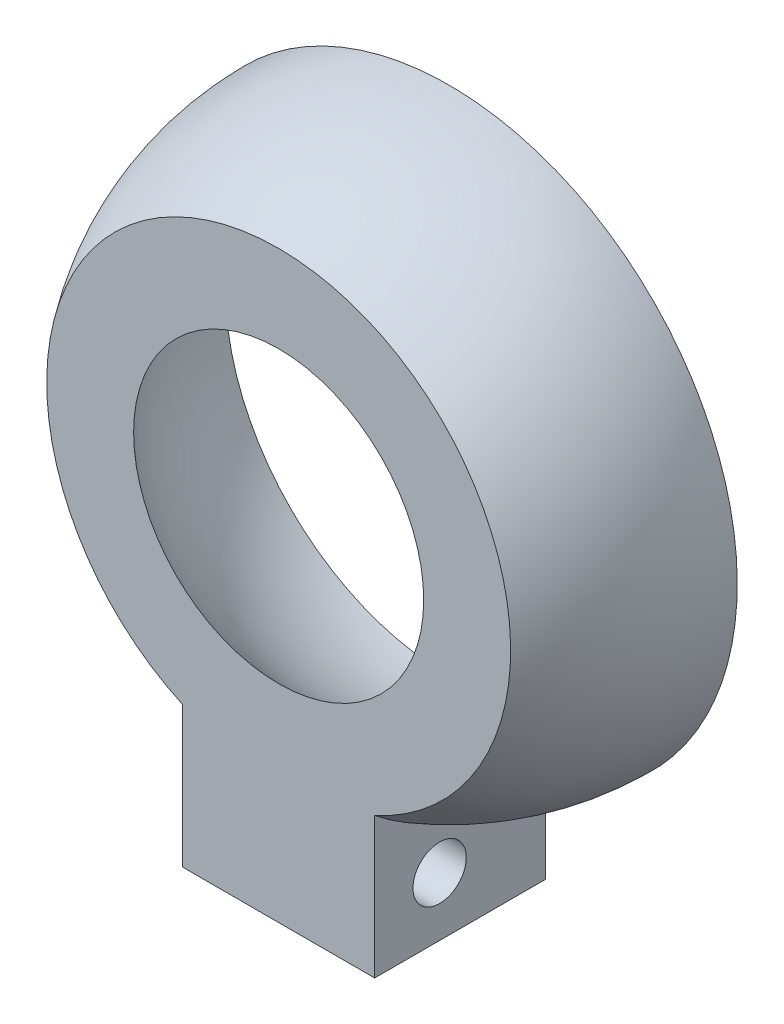
ISO-10303-21;
HEADER;
FILE_DESCRIPTION(('STEP AP214'),'2;1');
FILE_NAME('part.step','',(''),(''),'','','');
FILE_SCHEMA(('AUTOMOTIVE_DESIGN { 1 0 10303 214 1 1 1 1 }'));
ENDSEC;
DATA;
#1=APPLICATION_CONTEXT('core data for automotive mechanical design processes');
#2=APPLICATION_PROTOCOL_DEFINITION('international standard','automotive_design',2000,#1);
#3=PRODUCT_CONTEXT('',#1,'mechanical');
#4=PRODUCT('Part','Part','',(#3));
#5=PRODUCT_RELATED_PRODUCT_CATEGORY('part','',(#4));
#6=PRODUCT_DEFINITION_FORMATION('','',#4);
#7=PRODUCT_DEFINITION_CONTEXT('part definition',#1,'design');
#8=PRODUCT_DEFINITION('design','',#6,#7);
#9=PRODUCT_DEFINITION_SHAPE('','',#8);
#10=(LENGTH_UNIT() NAMED_UNIT(*) SI_UNIT(.MILLI.,.METRE.));
#11=(NAMED_UNIT(*) PLANE_ANGLE_UNIT() SI_UNIT($,.RADIAN.));
#12=(NAMED_UNIT(*) SI_UNIT($,.STERADIAN.) SOLID_ANGLE_UNIT());
#13=UNCERTAINTY_MEASURE_WITH_UNIT(LENGTH_MEASURE(1.E-05),#10,'distance_accuracy_value','');
#14=(GEOMETRIC_REPRESENTATION_CONTEXT(3) GLOBAL_UNCERTAINTY_ASSIGNED_CONTEXT((#13)) GLOBAL_UNIT_ASSIGNED_CONTEXT((#10,
#11,#12)) REPRESENTATION_CONTEXT('',''));
#15=CARTESIAN_POINT('',(0.,0.,0.));
#16=DIRECTION('',(0.,0.,1.));
#17=DIRECTION('',(1.,0.,0.));
#18=AXIS2_PLACEMENT_3D('',#15,#16,#17);
#19=CARTESIAN_POINT('',(-7.74999999999943,63.2499999999998,0.));
#20=DIRECTION('',(1.,0.,0.));
#21=DIRECTION('',(0.,0.,-1.));
#22=AXIS2_PLACEMENT_3D('',#19,#20,#21);
#23=PLANE('',#22);
#24=CARTESIAN_POINT('',(-7.74999999999943,62.9999999999998,-3.49670844934922));
#25=DIRECTION('',(1.,0.,0.));
#26=DIRECTION('',(0.,0.,-1.));
#27=AXIS2_PLACEMENT_3D('',#24,#25,#26);
#28=CIRCLE('',#27,1.25000000000004);
#29=CARTESIAN_POINT('',(-7.74999999999943,62.9999999999998,-4.74670844934926));
#30=VERTEX_POINT('',#29);
#31=EDGE_CURVE('E90',#30,#30,#28,.F.);
#32=ORIENTED_EDGE('',*,*,#31,.F.);
#33=EDGE_LOOP('',(#32));
#34=FACE_BOUND('',#33,.T.);
#35=CARTESIAN_POINT('',(-7.74999999999943,76.7499999999998,-8.45125390389471));
#36=DIRECTION('',(1.,0.,0.));
#37=DIRECTION('',(0.,0.,-1.));
#38=AXIS2_PLACEMENT_3D('',#35,#36,#37);
#39=CIRCLE('',#38,12.7279220613579);
#40=CARTESIAN_POINT('',(-7.74999999999943,64.022077938642,-8.45125390389471));
#41=VERTEX_POINT('',#40);
#42=CARTESIAN_POINT('',(-7.74999999999943,66.8505050633882,-0.451253903894706));
#43=VERTEX_POINT('',#42);
#44=EDGE_CURVE('E87',#41,#43,#39,.F.);
#45=ORIENTED_EDGE('',*,*,#44,.F.);
#46=DIRECTION('',(0.,-1.,0.));
#47=VECTOR('',#46,1.);
#48=CARTESIAN_POINT('',(-7.74999999999943,63.2499999999998,-8.45125390389471));
#49=LINE('',#48,#47);
#50=CARTESIAN_POINT('',(-7.74999999999943,60.2499999999998,-8.45125390389471));
#51=VERTEX_POINT('',#50);
#52=EDGE_CURVE('E43',#41,#51,#49,.T.);
#53=ORIENTED_EDGE('',*,*,#52,.T.);
#54=DIRECTION('',(0.,0.,1.));
#55=VECTOR('',#54,1.);
#56=CARTESIAN_POINT('',(-7.74999999999943,60.2499999999998,0.));
#57=LINE('',#56,#55);
#58=CARTESIAN_POINT('',(-7.74999999999943,60.2499999999998,-0.451253903894706));
#59=VERTEX_POINT('',#58);
#60=EDGE_CURVE('E108',#51,#59,#57,.T.);
#61=ORIENTED_EDGE('',*,*,#60,.T.);
#62=DIRECTION('',(0.,-1.,0.));
#63=VECTOR('',#62,1.);
#64=CARTESIAN_POINT('',(-7.74999999999943,63.2499999999998,-0.451253903894706));
#65=LINE('',#64,#63);
#66=EDGE_CURVE('E80',#43,#59,#65,.T.);
#67=ORIENTED_EDGE('',*,*,#66,.F.);
#68=EDGE_LOOP('',(#45,#53,#61,#67));
#69=FACE_BOUND('',#68,.T.);
#70=ADVANCED_FACE('F35',(#34,#69),#23,.F.);
#71=CARTESIAN_POINT('',(1.25000000000057,63.2499999999998,0.));
#72=DIRECTION('',(1.,0.,0.));
#73=DIRECTION('',(0.,0.,-1.));
#74=AXIS2_PLACEMENT_3D('',#71,#72,#73);
#75=PLANE('',#74);
#76=CARTESIAN_POINT('',(1.25000000000057,62.9999999999998,-3.49670844934922));
#77=DIRECTION('',(1.,0.,0.));
#78=DIRECTION('',(0.,0.,-1.));
#79=AXIS2_PLACEMENT_3D('',#76,#77,#78);
#80=CIRCLE('',#79,1.25000000000004);
#81=CARTESIAN_POINT('',(1.25000000000057,62.9999999999998,-4.74670844934926));
#82=VERTEX_POINT('',#81);
#83=EDGE_CURVE('E94',#82,#82,#80,.T.);
#84=ORIENTED_EDGE('',*,*,#83,.F.);
#85=EDGE_LOOP('',(#84));
#86=FACE_BOUND('',#85,.T.);
#87=DIRECTION('',(0.,-1.,0.));
#88=VECTOR('',#87,1.);
#89=CARTESIAN_POINT('',(1.25000000000057,63.2499999999998,-8.45125390389471));
#90=LINE('',#89,#88);
#91=CARTESIAN_POINT('',(1.25000000000057,64.022077938642,-8.45125390389471));
#92=VERTEX_POINT('',#91);
#93=CARTESIAN_POINT('',(1.25000000000057,60.2499999999998,-8.45125390389471));
#94=VERTEX_POINT('',#93);
#95=EDGE_CURVE('E57',#92,#94,#90,.T.);
#96=ORIENTED_EDGE('',*,*,#95,.F.);
#97=CARTESIAN_POINT('',(1.25000000000057,76.7499999999998,-8.45125390389471));
#98=DIRECTION('',(1.,0.,0.));
#99=DIRECTION('',(0.,0.,-1.));
#100=AXIS2_PLACEMENT_3D('',#97,#98,#99);
#101=CIRCLE('',#100,12.7279220613579);
#102=CARTESIAN_POINT('',(1.25000000000057,66.8505050633882,-0.451253903894707));
#103=VERTEX_POINT('',#102);
#104=EDGE_CURVE('E11',#92,#103,#101,.F.);
#105=ORIENTED_EDGE('',*,*,#104,.T.);
#106=DIRECTION('',(0.,-1.,0.));
#107=VECTOR('',#106,1.);
#108=CARTESIAN_POINT('',(1.25000000000057,63.2499999999998,-0.451253903894706));
#109=LINE('',#108,#107);
#110=CARTESIAN_POINT('',(1.25000000000057,60.2499999999998,-0.451253903894706));
#111=VERTEX_POINT('',#110);
#112=EDGE_CURVE('E74',#103,#111,#109,.T.);
#113=ORIENTED_EDGE('',*,*,#112,.T.);
#114=DIRECTION('',(0.,0.,1.));
#115=VECTOR('',#114,1.);
#116=CARTESIAN_POINT('',(1.25000000000057,60.2499999999998,0.));
#117=LINE('',#116,#115);
#118=EDGE_CURVE('E112',#94,#111,#117,.T.);
#119=ORIENTED_EDGE('',*,*,#118,.F.);
#120=EDGE_LOOP('',(#96,#105,#113,#119));
#121=FACE_BOUND('',#120,.T.);
#122=ADVANCED_FACE('F82',(#86,#121),#75,.T.);
#123=CARTESIAN_POINT('',(0.,63.2499999999998,-8.45125390389471));
#124=DIRECTION('',(0.,0.,-1.));
#125=DIRECTION('',(-1.,0.,0.));
#126=AXIS2_PLACEMENT_3D('',#123,#124,#125);
#127=PLANE('',#126);
#128=ORIENTED_EDGE('',*,*,#52,.F.);
#129=CARTESIAN_POINT('',(-3.24999999999943,76.7499999999998,-8.45125390389471));
#130=DIRECTION('',(0.,0.,1.));
#131=DIRECTION('',(1.,0.,0.));
#132=AXIS2_PLACEMENT_3D('',#129,#130,#131);
#133=CIRCLE('',#132,13.5);
#134=EDGE_CURVE('E89',#92,#41,#133,.T.);
#135=ORIENTED_EDGE('',*,*,#134,.F.);
#136=ORIENTED_EDGE('',*,*,#95,.T.);
#137=DIRECTION('',(1.,0.,0.));
#138=VECTOR('',#137,1.);
#139=CARTESIAN_POINT('',(0.,60.2499999999998,-8.45125390389471));
#140=LINE('',#139,#138);
#141=EDGE_CURVE('E105',#51,#94,#140,.T.);
#142=ORIENTED_EDGE('',*,*,#141,.F.);
#143=EDGE_LOOP('',(#128,#135,#136,#142));
#144=FACE_BOUND('',#143,.T.);
#145=CARTESIAN_POINT('',(-3.24999999999943,76.7499999999998,-8.4512539038947));
#146=DIRECTION('',(0.,0.,1.));
#147=DIRECTION('',(1.,0.,0.));
#148=AXIS2_PLACEMENT_3D('',#145,#146,#147);
#149=CIRCLE('',#148,10.5);
#150=CARTESIAN_POINT('',(7.25000000000056,76.7499999999998,-8.45125390389471));
#151=VERTEX_POINT('',#150);
#152=EDGE_CURVE('E99',#151,#151,#149,.T.);
#153=ORIENTED_EDGE('',*,*,#152,.T.);
#154=EDGE_LOOP('',(#153));
#155=FACE_BOUND('',#154,.T.);
#156=ADVANCED_FACE('F37',(#144,#155),#127,.T.);
#157=CARTESIAN_POINT('',(0.,63.2499999999998,-0.451253903894706));
#158=DIRECTION('',(0.,0.,-1.));
#159=DIRECTION('',(-1.,0.,0.));
#160=AXIS2_PLACEMENT_3D('',#157,#158,#159);
#161=PLANE('',#160);
#162=CARTESIAN_POINT('',(-3.24999999999943,76.7499999999998,-0.451253903894706));
#163=DIRECTION('',(0.,0.,1.));
#164=DIRECTION('',(1.,0.,0.));
#165=AXIS2_PLACEMENT_3D('',#162,#163,#164);
#166=CIRCLE('',#165,10.8742815854658);
#167=EDGE_CURVE('E50',#103,#43,#166,.T.);
#168=ORIENTED_EDGE('',*,*,#167,.T.);
#169=ORIENTED_EDGE('',*,*,#66,.T.);
#170=DIRECTION('',(1.,0.,0.));
#171=VECTOR('',#170,1.);
#172=CARTESIAN_POINT('',(0.,60.2499999999998,-0.451253903894706));
#173=LINE('',#172,#171);
#174=EDGE_CURVE('E78',#59,#111,#173,.T.);
#175=ORIENTED_EDGE('',*,*,#174,.T.);
#176=ORIENTED_EDGE('',*,*,#112,.F.);
#177=EDGE_LOOP('',(#168,#169,#175,#176));
#178=FACE_BOUND('',#177,.T.);
#179=CARTESIAN_POINT('',(-3.24999999999943,76.7499999999998,-0.451253903894706));
#180=DIRECTION('',(0.,0.,1.));
#181=DIRECTION('',(1.,0.,0.));
#182=AXIS2_PLACEMENT_3D('',#179,#180,#181);
#183=CIRCLE('',#182,6.80073525436771);
#184=CARTESIAN_POINT('',(3.55073525436828,76.7499999999998,-0.451253903894707));
#185=VERTEX_POINT('',#184);
#186=EDGE_CURVE('E102',#185,#185,#183,.T.);
#187=ORIENTED_EDGE('',*,*,#186,.F.);
#188=EDGE_LOOP('',(#187));
#189=FACE_BOUND('',#188,.T.);
#190=ADVANCED_FACE('F75',(#178,#189),#161,.F.);
#191=CARTESIAN_POINT('',(0.,60.2499999999998,0.));
#192=DIRECTION('',(0.,1.,0.));
#193=DIRECTION('',(0.,0.,1.));
#194=AXIS2_PLACEMENT_3D('',#191,#192,#193);
#195=PLANE('',#194);
#196=ORIENTED_EDGE('',*,*,#141,.T.);
#197=ORIENTED_EDGE('',*,*,#118,.T.);
#198=ORIENTED_EDGE('',*,*,#174,.F.);
#199=ORIENTED_EDGE('',*,*,#60,.F.);
#200=EDGE_LOOP('',(#196,#197,#198,#199));
#201=FACE_BOUND('',#200,.T.);
#202=ADVANCED_FACE('F121',(#201),#195,.F.);
#203=CARTESIAN_POINT('',(-3.24999999999943,76.7499999999998,-8.45125390389471));
#204=DIRECTION('',(0.,0.,1.));
#205=DIRECTION('',(0.,-1.,0.));
#206=AXIS2_PLACEMENT_3D('',#203,#204,#205);
#207=SPHERICAL_SURFACE('',#206,10.5);
#208=ORIENTED_EDGE('',*,*,#152,.F.);
#209=EDGE_LOOP('',(#208));
#210=FACE_BOUND('',#209,.T.);
#211=ORIENTED_EDGE('',*,*,#186,.T.);
#212=EDGE_LOOP('',(#211));
#213=FACE_BOUND('',#212,.T.);
#214=ADVANCED_FACE('F126',(#210,#213),#207,.F.);
#215=CARTESIAN_POINT('',(-3.24999999999943,76.7499999999998,-8.45125390389471));
#216=DIRECTION('',(0.,0.,1.));
#217=DIRECTION('',(0.,-1.,0.));
#218=AXIS2_PLACEMENT_3D('',#215,#216,#217);
#219=SPHERICAL_SURFACE('',#218,13.5);
#220=ORIENTED_EDGE('',*,*,#134,.T.);
#221=ORIENTED_EDGE('',*,*,#44,.T.);
#222=ORIENTED_EDGE('',*,*,#167,.F.);
#223=ORIENTED_EDGE('',*,*,#104,.F.);
#224=EDGE_LOOP('',(#220,#221,#222,#223));
#225=FACE_BOUND('',#224,.T.);
#226=ADVANCED_FACE('F85',(#225),#219,.T.);
#227=CARTESIAN_POINT('',(-16.7509999999994,62.9999999999998,-3.49670844934922));
#228=DIRECTION('',(1.,0.,0.));
#229=DIRECTION('',(0.,0.,-1.));
#230=AXIS2_PLACEMENT_3D('',#227,#228,#229);
#231=CYLINDRICAL_SURFACE('',#230,1.25000000000004);
#232=ORIENTED_EDGE('',*,*,#83,.T.);
#233=EDGE_LOOP('',(#232));
#234=FACE_BOUND('',#233,.T.);
#235=ORIENTED_EDGE('',*,*,#31,.T.);
#236=EDGE_LOOP('',(#235));
#237=FACE_BOUND('',#236,.T.);
#238=ADVANCED_FACE('F146',(#234,#237),#231,.F.);
#239=CLOSED_SHELL('',(#70,#122,#156,#190,#202,#214,#226,#238));
#240=MANIFOLD_SOLID_BREP('B2',#239);
#241=ADVANCED_BREP_SHAPE_REPRESENTATION('',(#18,#240),#14);
#242=SHAPE_DEFINITION_REPRESENTATION(#9,#241);
ENDSEC;
END-ISO-10303-21;
